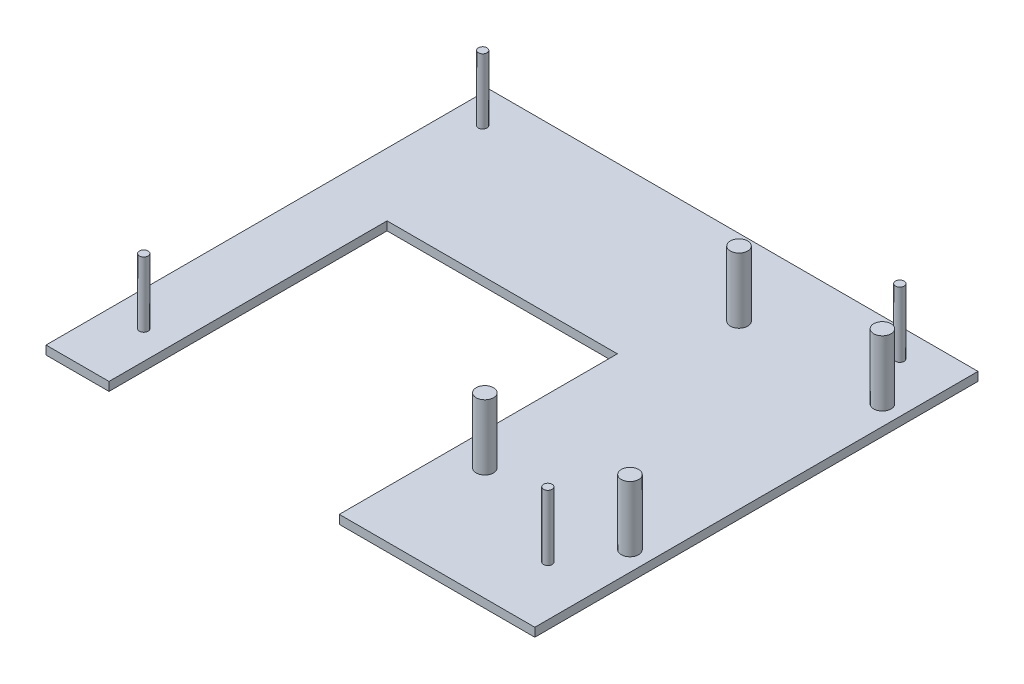
ISO-10303-21;
HEADER;
FILE_DESCRIPTION(('STEP AP214'),'2;1');
FILE_NAME('part.step','',(''),(''),'','','');
FILE_SCHEMA(('AUTOMOTIVE_DESIGN { 1 0 10303 214 1 1 1 1 }'));
ENDSEC;
DATA;
#1=APPLICATION_CONTEXT('core data for automotive mechanical design processes');
#2=APPLICATION_PROTOCOL_DEFINITION('international standard','automotive_design',2000,#1);
#3=PRODUCT_CONTEXT('',#1,'mechanical');
#4=PRODUCT('Part','Part','',(#3));
#5=PRODUCT_RELATED_PRODUCT_CATEGORY('part','',(#4));
#6=PRODUCT_DEFINITION_FORMATION('','',#4);
#7=PRODUCT_DEFINITION_CONTEXT('part definition',#1,'design');
#8=PRODUCT_DEFINITION('design','',#6,#7);
#9=PRODUCT_DEFINITION_SHAPE('','',#8);
#10=(LENGTH_UNIT() NAMED_UNIT(*) SI_UNIT(.MILLI.,.METRE.));
#11=(NAMED_UNIT(*) PLANE_ANGLE_UNIT() SI_UNIT($,.RADIAN.));
#12=(NAMED_UNIT(*) SI_UNIT($,.STERADIAN.) SOLID_ANGLE_UNIT());
#13=UNCERTAINTY_MEASURE_WITH_UNIT(LENGTH_MEASURE(1.E-05),#10,'distance_accuracy_value','');
#14=(GEOMETRIC_REPRESENTATION_CONTEXT(3) GLOBAL_UNCERTAINTY_ASSIGNED_CONTEXT((#13)) GLOBAL_UNIT_ASSIGNED_CONTEXT((#10,
#11,#12)) REPRESENTATION_CONTEXT('',''));
#15=CARTESIAN_POINT('',(0.,0.,0.));
#16=DIRECTION('',(0.,0.,1.));
#17=DIRECTION('',(1.,0.,0.));
#18=AXIS2_PLACEMENT_3D('',#15,#16,#17);
#19=CARTESIAN_POINT('',(-60.,2.,60.));
#20=DIRECTION('',(0.,0.,-1.));
#21=DIRECTION('',(-1.,0.,0.));
#22=AXIS2_PLACEMENT_3D('',#19,#20,#21);
#23=PLANE('',#22);
#24=DIRECTION('',(1.,0.,0.));
#25=VECTOR('',#24,1.);
#26=CARTESIAN_POINT('',(-60.,0.,60.));
#27=LINE('',#26,#25);
#28=CARTESIAN_POINT('',(-52.5000000000147,0.,60.0000000000187));
#29=VERTEX_POINT('',#28);
#30=CARTESIAN_POINT('',(-37.9999999999998,0.,60.0000000000187));
#31=VERTEX_POINT('',#30);
#32=EDGE_CURVE('E119',#29,#31,#27,.T.);
#33=ORIENTED_EDGE('',*,*,#32,.T.);
#34=DIRECTION('',(0.,1.,0.));
#35=VECTOR('',#34,1.);
#36=CARTESIAN_POINT('',(-37.9999999999998,-13.,60.0000000000187));
#37=LINE('',#36,#35);
#38=CARTESIAN_POINT('',(-37.9999999999998,2.,60.0000000000187));
#39=VERTEX_POINT('',#38);
#40=EDGE_CURVE('E104',#31,#39,#37,.T.);
#41=ORIENTED_EDGE('',*,*,#40,.T.);
#42=DIRECTION('',(1.,0.,0.));
#43=VECTOR('',#42,1.);
#44=CARTESIAN_POINT('',(-60.,2.,60.));
#45=LINE('',#44,#43);
#46=CARTESIAN_POINT('',(-52.5000000000147,2.,60.0000000000187));
#47=VERTEX_POINT('',#46);
#48=EDGE_CURVE('E117',#47,#39,#45,.T.);
#49=ORIENTED_EDGE('',*,*,#48,.F.);
#50=DIRECTION('',(0.,1.,0.));
#51=VECTOR('',#50,1.);
#52=CARTESIAN_POINT('',(-52.5000000000147,-13.,60.0000000000187));
#53=LINE('',#52,#51);
#54=EDGE_CURVE('E166',#29,#47,#53,.T.);
#55=ORIENTED_EDGE('',*,*,#54,.F.);
#56=EDGE_LOOP('',(#33,#41,#49,#55));
#57=FACE_BOUND('',#56,.T.);
#58=ADVANCED_FACE('F37',(#57),#23,.F.);
#59=CARTESIAN_POINT('',(60.,2.,-60.));
#60=DIRECTION('',(-1.,0.,0.));
#61=DIRECTION('',(0.,0.,1.));
#62=AXIS2_PLACEMENT_3D('',#59,#60,#61);
#63=PLANE('',#62);
#64=DIRECTION('',(0.,0.,-1.));
#65=VECTOR('',#64,1.);
#66=CARTESIAN_POINT('',(60.,0.,-60.));
#67=LINE('',#66,#65);
#68=CARTESIAN_POINT('',(60.,0.,60.));
#69=VERTEX_POINT('',#68);
#70=CARTESIAN_POINT('',(60.000000000006,0.,-41.9999999999999));
#71=VERTEX_POINT('',#70);
#72=EDGE_CURVE('E138',#69,#71,#67,.T.);
#73=ORIENTED_EDGE('',*,*,#72,.T.);
#74=DIRECTION('',(0.,1.,0.));
#75=VECTOR('',#74,1.);
#76=CARTESIAN_POINT('',(60.000000000006,-13.,-41.9999999999999));
#77=LINE('',#76,#75);
#78=CARTESIAN_POINT('',(60.000000000006,2.,-41.9999999999999));
#79=VERTEX_POINT('',#78);
#80=EDGE_CURVE('E167',#71,#79,#77,.T.);
#81=ORIENTED_EDGE('',*,*,#80,.T.);
#82=DIRECTION('',(0.,0.,-1.));
#83=VECTOR('',#82,1.);
#84=CARTESIAN_POINT('',(60.,2.,-60.));
#85=LINE('',#84,#83);
#86=CARTESIAN_POINT('',(60.,2.,60.));
#87=VERTEX_POINT('',#86);
#88=EDGE_CURVE('E134',#87,#79,#85,.T.);
#89=ORIENTED_EDGE('',*,*,#88,.F.);
#90=DIRECTION('',(0.,-1.,0.));
#91=VECTOR('',#90,1.);
#92=CARTESIAN_POINT('',(60.,2.,60.));
#93=LINE('',#92,#91);
#94=EDGE_CURVE('E128',#87,#69,#93,.T.);
#95=ORIENTED_EDGE('',*,*,#94,.T.);
#96=EDGE_LOOP('',(#73,#81,#89,#95));
#97=FACE_BOUND('',#96,.T.);
#98=ADVANCED_FACE('F39',(#97),#63,.F.);
#99=CARTESIAN_POINT('',(15.0000000000002,2.,60.0000000000187));
#100=VERTEX_POINT('',#99);
#101=EDGE_CURVE('E129',#100,#87,#45,.T.);
#102=ORIENTED_EDGE('',*,*,#101,.F.);
#103=DIRECTION('',(0.,1.,0.));
#104=VECTOR('',#103,1.);
#105=CARTESIAN_POINT('',(15.0000000000002,-13.,60.0000000000187));
#106=LINE('',#105,#104);
#107=CARTESIAN_POINT('',(15.0000000000002,0.,60.0000000000187));
#108=VERTEX_POINT('',#107);
#109=EDGE_CURVE('E120',#108,#100,#106,.T.);
#110=ORIENTED_EDGE('',*,*,#109,.F.);
#111=EDGE_CURVE('E141',#108,#69,#27,.T.);
#112=ORIENTED_EDGE('',*,*,#111,.T.);
#113=ORIENTED_EDGE('',*,*,#94,.F.);
#114=EDGE_LOOP('',(#102,#110,#112,#113));
#115=FACE_BOUND('',#114,.T.);
#116=ADVANCED_FACE('F222',(#115),#23,.F.);
#117=CARTESIAN_POINT('',(0.,2.,0.));
#118=DIRECTION('',(0.,1.,0.));
#119=DIRECTION('',(0.,0.,1.));
#120=AXIS2_PLACEMENT_3D('',#117,#118,#119);
#121=PLANE('',#120);
#122=DIRECTION('',(0.,0.,1.));
#123=VECTOR('',#122,1.);
#124=CARTESIAN_POINT('',(-37.9999999999999,2.,-4.00000000000009));
#125=LINE('',#124,#123);
#126=CARTESIAN_POINT('',(-37.9999999999999,2.,-4.00000000000009));
#127=VERTEX_POINT('',#126);
#128=EDGE_CURVE('E101',#127,#39,#125,.T.);
#129=ORIENTED_EDGE('',*,*,#128,.F.);
#130=DIRECTION('',(-1.,0.,0.));
#131=VECTOR('',#130,1.);
#132=CARTESIAN_POINT('',(-37.9999999999999,2.,-4.00000000000009));
#133=LINE('',#132,#131);
#134=CARTESIAN_POINT('',(15.0000000000002,2.,-4.00000000000009));
#135=VERTEX_POINT('',#134);
#136=EDGE_CURVE('E121',#135,#127,#133,.T.);
#137=ORIENTED_EDGE('',*,*,#136,.F.);
#138=DIRECTION('',(0.,0.,-1.));
#139=VECTOR('',#138,1.);
#140=CARTESIAN_POINT('',(15.0000000000002,2.,-4.00000000000009));
#141=LINE('',#140,#139);
#142=EDGE_CURVE('E111',#100,#135,#141,.T.);
#143=ORIENTED_EDGE('',*,*,#142,.F.);
#144=ORIENTED_EDGE('',*,*,#101,.T.);
#145=ORIENTED_EDGE('',*,*,#88,.T.);
#146=DIRECTION('',(1.00000000000035,0.,0.));
#147=VECTOR('',#146,1.);
#148=CARTESIAN_POINT('',(0.,2.,-41.9999999999999));
#149=LINE('',#148,#147);
#150=CARTESIAN_POINT('',(-52.5000000000092,2.,-41.9999999999999));
#151=VERTEX_POINT('',#150);
#152=EDGE_CURVE('E158',#151,#79,#149,.T.);
#153=ORIENTED_EDGE('',*,*,#152,.F.);
#154=DIRECTION('',(0.,0.,-1.00000000000028));
#155=VECTOR('',#154,1.);
#156=CARTESIAN_POINT('',(-52.5000000000172,2.,0.));
#157=LINE('',#156,#155);
#158=EDGE_CURVE('E127',#47,#151,#157,.T.);
#159=ORIENTED_EDGE('',*,*,#158,.F.);
#160=ORIENTED_EDGE('',*,*,#48,.T.);
#161=EDGE_LOOP('',(#129,#137,#143,#144,#145,#153,#159,#160));
#162=FACE_BOUND('',#161,.T.);
#163=CARTESIAN_POINT('',(-44.4999999999998,2.,45.4999999999999));
#164=DIRECTION('',(0.,1.,0.));
#165=DIRECTION('',(0.,0.,1.));
#166=AXIS2_PLACEMENT_3D('',#163,#164,#165);
#167=CIRCLE('',#166,0.999999999999998);
#168=CARTESIAN_POINT('',(-44.4999999999998,2.,46.4999999999999));
#169=VERTEX_POINT('',#168);
#170=EDGE_CURVE('E173',#169,#169,#167,.T.);
#171=ORIENTED_EDGE('',*,*,#170,.F.);
#172=EDGE_LOOP('',(#171));
#173=FACE_BOUND('',#172,.T.);
#174=CARTESIAN_POINT('',(-45.9999999999997,2.,-34.0000000000001));
#175=DIRECTION('',(0.,1.,0.));
#176=DIRECTION('',(0.,0.,1.));
#177=AXIS2_PLACEMENT_3D('',#174,#175,#176);
#178=CIRCLE('',#177,0.999999999999998);
#179=CARTESIAN_POINT('',(-45.9999999999997,2.,-33.0000000000001));
#180=VERTEX_POINT('',#179);
#181=EDGE_CURVE('E179',#180,#180,#178,.T.);
#182=ORIENTED_EDGE('',*,*,#181,.F.);
#183=EDGE_LOOP('',(#182));
#184=FACE_BOUND('',#183,.T.);
#185=CARTESIAN_POINT('',(48.5000000000003,2.,-35.4999999999999));
#186=DIRECTION('',(0.,1.,0.));
#187=DIRECTION('',(0.,0.,1.));
#188=AXIS2_PLACEMENT_3D('',#185,#186,#187);
#189=CIRCLE('',#188,0.999999999999998);
#190=CARTESIAN_POINT('',(48.5000000000003,2.,-34.4999999999999));
#191=VERTEX_POINT('',#190);
#192=EDGE_CURVE('E185',#191,#191,#189,.T.);
#193=ORIENTED_EDGE('',*,*,#192,.F.);
#194=EDGE_LOOP('',(#193));
#195=FACE_BOUND('',#194,.T.);
#196=CARTESIAN_POINT('',(22.5000000000003,2.,-24.5));
#197=DIRECTION('',(0.,1.,0.));
#198=DIRECTION('',(0.,0.,1.));
#199=AXIS2_PLACEMENT_3D('',#196,#197,#198);
#200=CIRCLE('',#199,2.);
#201=CARTESIAN_POINT('',(22.5000000000003,2.,-22.5));
#202=VERTEX_POINT('',#201);
#203=EDGE_CURVE('E191',#202,#202,#200,.T.);
#204=ORIENTED_EDGE('',*,*,#203,.F.);
#205=EDGE_LOOP('',(#204));
#206=FACE_BOUND('',#205,.T.);
#207=CARTESIAN_POINT('',(22.5000000000002,2.,34.0000000000001));
#208=DIRECTION('',(0.,1.,0.));
#209=DIRECTION('',(0.,0.,1.));
#210=AXIS2_PLACEMENT_3D('',#207,#208,#209);
#211=CIRCLE('',#210,2.);
#212=CARTESIAN_POINT('',(22.5000000000002,2.,36.0000000000001));
#213=VERTEX_POINT('',#212);
#214=EDGE_CURVE('E197',#213,#213,#211,.T.);
#215=ORIENTED_EDGE('',*,*,#214,.F.);
#216=EDGE_LOOP('',(#215));
#217=FACE_BOUND('',#216,.T.);
#218=CARTESIAN_POINT('',(48.5000000000002,2.,45.5000000000001));
#219=DIRECTION('',(0.,1.,0.));
#220=DIRECTION('',(0.,0.,1.));
#221=AXIS2_PLACEMENT_3D('',#218,#219,#220);
#222=CIRCLE('',#221,0.999999999999998);
#223=CARTESIAN_POINT('',(48.5000000000002,2.,46.5000000000001));
#224=VERTEX_POINT('',#223);
#225=EDGE_CURVE('E203',#224,#224,#222,.T.);
#226=ORIENTED_EDGE('',*,*,#225,.F.);
#227=EDGE_LOOP('',(#226));
#228=FACE_BOUND('',#227,.T.);
#229=CARTESIAN_POINT('',(55.5000000000002,2.,33.6000000000001));
#230=DIRECTION('',(0.,1.,0.));
#231=DIRECTION('',(0.,0.,1.));
#232=AXIS2_PLACEMENT_3D('',#229,#230,#231);
#233=CIRCLE('',#232,2.);
#234=CARTESIAN_POINT('',(55.5000000000002,2.,35.6000000000001));
#235=VERTEX_POINT('',#234);
#236=EDGE_CURVE('E209',#235,#235,#233,.T.);
#237=ORIENTED_EDGE('',*,*,#236,.F.);
#238=EDGE_LOOP('',(#237));
#239=FACE_BOUND('',#238,.T.);
#240=CARTESIAN_POINT('',(55.5000000000003,2.,-24.4999999999999));
#241=DIRECTION('',(0.,1.,0.));
#242=DIRECTION('',(0.,0.,1.));
#243=AXIS2_PLACEMENT_3D('',#240,#241,#242);
#244=CIRCLE('',#243,2.);
#245=CARTESIAN_POINT('',(55.5000000000003,2.,-22.4999999999999));
#246=VERTEX_POINT('',#245);
#247=EDGE_CURVE('E212',#246,#246,#244,.T.);
#248=ORIENTED_EDGE('',*,*,#247,.F.);
#249=EDGE_LOOP('',(#248));
#250=FACE_BOUND('',#249,.T.);
#251=ADVANCED_FACE('F124',(#162,#173,#184,#195,#206,#217,#228,#239,#250),#121,.T.);
#252=CARTESIAN_POINT('',(0.,0.,0.));
#253=DIRECTION('',(0.,1.,0.));
#254=DIRECTION('',(0.,0.,1.));
#255=AXIS2_PLACEMENT_3D('',#252,#253,#254);
#256=PLANE('',#255);
#257=DIRECTION('',(-1.,0.,0.));
#258=VECTOR('',#257,1.);
#259=CARTESIAN_POINT('',(0.,0.,-4.00000000000009));
#260=LINE('',#259,#258);
#261=CARTESIAN_POINT('',(15.0000000000002,0.,-4.00000000000009));
#262=VERTEX_POINT('',#261);
#263=CARTESIAN_POINT('',(-37.9999999999999,0.,-4.00000000000009));
#264=VERTEX_POINT('',#263);
#265=EDGE_CURVE('E45',#262,#264,#260,.T.);
#266=ORIENTED_EDGE('',*,*,#265,.T.);
#267=DIRECTION('',(0.,0.,1.));
#268=VECTOR('',#267,1.);
#269=CARTESIAN_POINT('',(-37.9999999999999,0.,0.));
#270=LINE('',#269,#268);
#271=EDGE_CURVE('E11',#264,#31,#270,.T.);
#272=ORIENTED_EDGE('',*,*,#271,.T.);
#273=ORIENTED_EDGE('',*,*,#32,.F.);
#274=DIRECTION('',(0.,0.,-1.));
#275=VECTOR('',#274,1.);
#276=CARTESIAN_POINT('',(-52.5000000000172,0.,0.));
#277=LINE('',#276,#275);
#278=CARTESIAN_POINT('',(-52.5000000000172,0.,-41.9999999999999));
#279=VERTEX_POINT('',#278);
#280=EDGE_CURVE('E132',#29,#279,#277,.T.);
#281=ORIENTED_EDGE('',*,*,#280,.T.);
#282=DIRECTION('',(1.,0.,0.));
#283=VECTOR('',#282,1.);
#284=CARTESIAN_POINT('',(0.,0.,-41.9999999999999));
#285=LINE('',#284,#283);
#286=EDGE_CURVE('E146',#279,#71,#285,.T.);
#287=ORIENTED_EDGE('',*,*,#286,.T.);
#288=ORIENTED_EDGE('',*,*,#72,.F.);
#289=ORIENTED_EDGE('',*,*,#111,.F.);
#290=DIRECTION('',(0.,0.,-1.));
#291=VECTOR('',#290,1.);
#292=CARTESIAN_POINT('',(15.0000000000002,0.,0.));
#293=LINE('',#292,#291);
#294=EDGE_CURVE('E149',#108,#262,#293,.T.);
#295=ORIENTED_EDGE('',*,*,#294,.T.);
#296=EDGE_LOOP('',(#266,#272,#273,#281,#287,#288,#289,#295));
#297=FACE_BOUND('',#296,.T.);
#298=ADVANCED_FACE('F153',(#297),#256,.F.);
#299=CARTESIAN_POINT('',(55.5000000000003,17.,-24.4999999999999));
#300=DIRECTION('',(0.,-1.,0.));
#301=DIRECTION('',(0.,0.,-1.));
#302=AXIS2_PLACEMENT_3D('',#299,#300,#301);
#303=CYLINDRICAL_SURFACE('',#302,2.);
#304=CARTESIAN_POINT('',(55.5000000000003,17.,-24.4999999999999));
#305=DIRECTION('',(0.,1.,0.));
#306=DIRECTION('',(0.,0.,1.));
#307=AXIS2_PLACEMENT_3D('',#304,#305,#306);
#308=CIRCLE('',#307,2.);
#309=CARTESIAN_POINT('',(55.5000000000003,17.,-22.4999999999999));
#310=VERTEX_POINT('',#309);
#311=EDGE_CURVE('E142',#310,#310,#308,.T.);
#312=ORIENTED_EDGE('',*,*,#311,.F.);
#313=EDGE_LOOP('',(#312));
#314=FACE_BOUND('',#313,.T.);
#315=ORIENTED_EDGE('',*,*,#247,.T.);
#316=EDGE_LOOP('',(#315));
#317=FACE_BOUND('',#316,.T.);
#318=ADVANCED_FACE('F219',(#314,#317),#303,.T.);
#319=CARTESIAN_POINT('',(55.5000000000003,17.,-24.4999999999999));
#320=DIRECTION('',(0.,1.,0.));
#321=DIRECTION('',(0.,0.,1.));
#322=AXIS2_PLACEMENT_3D('',#319,#320,#321);
#323=PLANE('',#322);
#324=ORIENTED_EDGE('',*,*,#311,.T.);
#325=EDGE_LOOP('',(#324));
#326=FACE_BOUND('',#325,.T.);
#327=ADVANCED_FACE('F314',(#326),#323,.T.);
#328=CARTESIAN_POINT('',(55.5000000000002,17.,33.6000000000001));
#329=DIRECTION('',(0.,-1.,0.));
#330=DIRECTION('',(0.,0.,-1.));
#331=AXIS2_PLACEMENT_3D('',#328,#329,#330);
#332=CYLINDRICAL_SURFACE('',#331,2.);
#333=CARTESIAN_POINT('',(55.5000000000002,17.,33.6000000000001));
#334=DIRECTION('',(0.,1.,0.));
#335=DIRECTION('',(0.,0.,1.));
#336=AXIS2_PLACEMENT_3D('',#333,#334,#335);
#337=CIRCLE('',#336,2.);
#338=CARTESIAN_POINT('',(55.5000000000002,17.,35.6000000000001));
#339=VERTEX_POINT('',#338);
#340=EDGE_CURVE('E206',#339,#339,#337,.T.);
#341=ORIENTED_EDGE('',*,*,#340,.F.);
#342=EDGE_LOOP('',(#341));
#343=FACE_BOUND('',#342,.T.);
#344=ORIENTED_EDGE('',*,*,#236,.T.);
#345=EDGE_LOOP('',(#344));
#346=FACE_BOUND('',#345,.T.);
#347=ADVANCED_FACE('F311',(#343,#346),#332,.T.);
#348=CARTESIAN_POINT('',(55.5000000000002,17.,33.6000000000001));
#349=DIRECTION('',(0.,1.,0.));
#350=DIRECTION('',(0.,0.,1.));
#351=AXIS2_PLACEMENT_3D('',#348,#349,#350);
#352=PLANE('',#351);
#353=ORIENTED_EDGE('',*,*,#340,.T.);
#354=EDGE_LOOP('',(#353));
#355=FACE_BOUND('',#354,.T.);
#356=ADVANCED_FACE('F306',(#355),#352,.T.);
#357=CARTESIAN_POINT('',(48.5000000000002,17.,45.5000000000001));
#358=DIRECTION('',(0.,-1.,0.));
#359=DIRECTION('',(0.,0.,-1.));
#360=AXIS2_PLACEMENT_3D('',#357,#358,#359);
#361=CYLINDRICAL_SURFACE('',#360,0.999999999999998);
#362=CARTESIAN_POINT('',(48.5000000000002,17.,45.5000000000001));
#363=DIRECTION('',(0.,1.,0.));
#364=DIRECTION('',(0.,0.,1.));
#365=AXIS2_PLACEMENT_3D('',#362,#363,#364);
#366=CIRCLE('',#365,0.999999999999998);
#367=CARTESIAN_POINT('',(48.5000000000002,17.,46.5000000000001));
#368=VERTEX_POINT('',#367);
#369=EDGE_CURVE('E200',#368,#368,#366,.T.);
#370=ORIENTED_EDGE('',*,*,#369,.F.);
#371=EDGE_LOOP('',(#370));
#372=FACE_BOUND('',#371,.T.);
#373=ORIENTED_EDGE('',*,*,#225,.T.);
#374=EDGE_LOOP('',(#373));
#375=FACE_BOUND('',#374,.T.);
#376=ADVANCED_FACE('F303',(#372,#375),#361,.T.);
#377=CARTESIAN_POINT('',(48.5000000000002,17.,45.5000000000001));
#378=DIRECTION('',(0.,1.,0.));
#379=DIRECTION('',(0.,0.,1.));
#380=AXIS2_PLACEMENT_3D('',#377,#378,#379);
#381=PLANE('',#380);
#382=ORIENTED_EDGE('',*,*,#369,.T.);
#383=EDGE_LOOP('',(#382));
#384=FACE_BOUND('',#383,.T.);
#385=ADVANCED_FACE('F298',(#384),#381,.T.);
#386=CARTESIAN_POINT('',(22.5000000000002,17.,34.0000000000001));
#387=DIRECTION('',(0.,-1.,0.));
#388=DIRECTION('',(0.,0.,-1.));
#389=AXIS2_PLACEMENT_3D('',#386,#387,#388);
#390=CYLINDRICAL_SURFACE('',#389,2.);
#391=CARTESIAN_POINT('',(22.5000000000002,17.,34.0000000000001));
#392=DIRECTION('',(0.,1.,0.));
#393=DIRECTION('',(0.,0.,1.));
#394=AXIS2_PLACEMENT_3D('',#391,#392,#393);
#395=CIRCLE('',#394,2.);
#396=CARTESIAN_POINT('',(22.5000000000002,17.,36.0000000000001));
#397=VERTEX_POINT('',#396);
#398=EDGE_CURVE('E194',#397,#397,#395,.T.);
#399=ORIENTED_EDGE('',*,*,#398,.F.);
#400=EDGE_LOOP('',(#399));
#401=FACE_BOUND('',#400,.T.);
#402=ORIENTED_EDGE('',*,*,#214,.T.);
#403=EDGE_LOOP('',(#402));
#404=FACE_BOUND('',#403,.T.);
#405=ADVANCED_FACE('F295',(#401,#404),#390,.T.);
#406=CARTESIAN_POINT('',(22.5000000000002,17.,34.0000000000001));
#407=DIRECTION('',(0.,1.,0.));
#408=DIRECTION('',(0.,0.,1.));
#409=AXIS2_PLACEMENT_3D('',#406,#407,#408);
#410=PLANE('',#409);
#411=ORIENTED_EDGE('',*,*,#398,.T.);
#412=EDGE_LOOP('',(#411));
#413=FACE_BOUND('',#412,.T.);
#414=ADVANCED_FACE('F290',(#413),#410,.T.);
#415=CARTESIAN_POINT('',(22.5000000000003,17.,-24.5));
#416=DIRECTION('',(0.,-1.,0.));
#417=DIRECTION('',(0.,0.,-1.));
#418=AXIS2_PLACEMENT_3D('',#415,#416,#417);
#419=CYLINDRICAL_SURFACE('',#418,2.);
#420=CARTESIAN_POINT('',(22.5000000000003,17.,-24.5));
#421=DIRECTION('',(0.,1.,0.));
#422=DIRECTION('',(0.,0.,1.));
#423=AXIS2_PLACEMENT_3D('',#420,#421,#422);
#424=CIRCLE('',#423,2.);
#425=CARTESIAN_POINT('',(22.5000000000003,17.,-22.5));
#426=VERTEX_POINT('',#425);
#427=EDGE_CURVE('E188',#426,#426,#424,.T.);
#428=ORIENTED_EDGE('',*,*,#427,.F.);
#429=EDGE_LOOP('',(#428));
#430=FACE_BOUND('',#429,.T.);
#431=ORIENTED_EDGE('',*,*,#203,.T.);
#432=EDGE_LOOP('',(#431));
#433=FACE_BOUND('',#432,.T.);
#434=ADVANCED_FACE('F287',(#430,#433),#419,.T.);
#435=CARTESIAN_POINT('',(22.5000000000003,17.,-24.5));
#436=DIRECTION('',(0.,1.,0.));
#437=DIRECTION('',(0.,0.,1.));
#438=AXIS2_PLACEMENT_3D('',#435,#436,#437);
#439=PLANE('',#438);
#440=ORIENTED_EDGE('',*,*,#427,.T.);
#441=EDGE_LOOP('',(#440));
#442=FACE_BOUND('',#441,.T.);
#443=ADVANCED_FACE('F282',(#442),#439,.T.);
#444=CARTESIAN_POINT('',(48.5000000000003,17.,-35.4999999999999));
#445=DIRECTION('',(0.,-1.,0.));
#446=DIRECTION('',(0.,0.,-1.));
#447=AXIS2_PLACEMENT_3D('',#444,#445,#446);
#448=CYLINDRICAL_SURFACE('',#447,0.999999999999998);
#449=CARTESIAN_POINT('',(48.5000000000003,17.,-35.4999999999999));
#450=DIRECTION('',(0.,1.,0.));
#451=DIRECTION('',(0.,0.,1.));
#452=AXIS2_PLACEMENT_3D('',#449,#450,#451);
#453=CIRCLE('',#452,0.999999999999998);
#454=CARTESIAN_POINT('',(48.5000000000003,17.,-34.4999999999999));
#455=VERTEX_POINT('',#454);
#456=EDGE_CURVE('E182',#455,#455,#453,.T.);
#457=ORIENTED_EDGE('',*,*,#456,.F.);
#458=EDGE_LOOP('',(#457));
#459=FACE_BOUND('',#458,.T.);
#460=ORIENTED_EDGE('',*,*,#192,.T.);
#461=EDGE_LOOP('',(#460));
#462=FACE_BOUND('',#461,.T.);
#463=ADVANCED_FACE('F279',(#459,#462),#448,.T.);
#464=CARTESIAN_POINT('',(48.5000000000003,17.,-35.4999999999999));
#465=DIRECTION('',(0.,1.,0.));
#466=DIRECTION('',(0.,0.,1.));
#467=AXIS2_PLACEMENT_3D('',#464,#465,#466);
#468=PLANE('',#467);
#469=ORIENTED_EDGE('',*,*,#456,.T.);
#470=EDGE_LOOP('',(#469));
#471=FACE_BOUND('',#470,.T.);
#472=ADVANCED_FACE('F274',(#471),#468,.T.);
#473=CARTESIAN_POINT('',(-45.9999999999997,17.,-34.0000000000001));
#474=DIRECTION('',(0.,-1.,0.));
#475=DIRECTION('',(0.,0.,-1.));
#476=AXIS2_PLACEMENT_3D('',#473,#474,#475);
#477=CYLINDRICAL_SURFACE('',#476,0.999999999999998);
#478=CARTESIAN_POINT('',(-45.9999999999997,17.,-34.0000000000001));
#479=DIRECTION('',(0.,1.,0.));
#480=DIRECTION('',(0.,0.,1.));
#481=AXIS2_PLACEMENT_3D('',#478,#479,#480);
#482=CIRCLE('',#481,0.999999999999998);
#483=CARTESIAN_POINT('',(-45.9999999999997,17.,-33.0000000000001));
#484=VERTEX_POINT('',#483);
#485=EDGE_CURVE('E176',#484,#484,#482,.T.);
#486=ORIENTED_EDGE('',*,*,#485,.F.);
#487=EDGE_LOOP('',(#486));
#488=FACE_BOUND('',#487,.T.);
#489=ORIENTED_EDGE('',*,*,#181,.T.);
#490=EDGE_LOOP('',(#489));
#491=FACE_BOUND('',#490,.T.);
#492=ADVANCED_FACE('F271',(#488,#491),#477,.T.);
#493=CARTESIAN_POINT('',(-45.9999999999997,17.,-34.0000000000001));
#494=DIRECTION('',(0.,1.,0.));
#495=DIRECTION('',(0.,0.,1.));
#496=AXIS2_PLACEMENT_3D('',#493,#494,#495);
#497=PLANE('',#496);
#498=ORIENTED_EDGE('',*,*,#485,.T.);
#499=EDGE_LOOP('',(#498));
#500=FACE_BOUND('',#499,.T.);
#501=ADVANCED_FACE('F266',(#500),#497,.T.);
#502=CARTESIAN_POINT('',(-44.4999999999998,17.,45.4999999999999));
#503=DIRECTION('',(0.,-1.,0.));
#504=DIRECTION('',(0.,0.,-1.));
#505=AXIS2_PLACEMENT_3D('',#502,#503,#504);
#506=CYLINDRICAL_SURFACE('',#505,0.999999999999998);
#507=CARTESIAN_POINT('',(-44.4999999999998,17.,45.4999999999999));
#508=DIRECTION('',(0.,1.,0.));
#509=DIRECTION('',(0.,0.,1.));
#510=AXIS2_PLACEMENT_3D('',#507,#508,#509);
#511=CIRCLE('',#510,0.999999999999998);
#512=CARTESIAN_POINT('',(-44.4999999999998,17.,46.4999999999999));
#513=VERTEX_POINT('',#512);
#514=EDGE_CURVE('E170',#513,#513,#511,.T.);
#515=ORIENTED_EDGE('',*,*,#514,.F.);
#516=EDGE_LOOP('',(#515));
#517=FACE_BOUND('',#516,.T.);
#518=ORIENTED_EDGE('',*,*,#170,.T.);
#519=EDGE_LOOP('',(#518));
#520=FACE_BOUND('',#519,.T.);
#521=ADVANCED_FACE('F263',(#517,#520),#506,.T.);
#522=CARTESIAN_POINT('',(-44.4999999999998,17.,45.4999999999999));
#523=DIRECTION('',(0.,1.,0.));
#524=DIRECTION('',(0.,0.,1.));
#525=AXIS2_PLACEMENT_3D('',#522,#523,#524);
#526=PLANE('',#525);
#527=ORIENTED_EDGE('',*,*,#514,.T.);
#528=EDGE_LOOP('',(#527));
#529=FACE_BOUND('',#528,.T.);
#530=ADVANCED_FACE('F260',(#529),#526,.T.);
#531=CARTESIAN_POINT('',(0.,-13.,-41.9999999999999));
#532=DIRECTION('',(0.,0.,1.));
#533=DIRECTION('',(1.,0.,0.));
#534=AXIS2_PLACEMENT_3D('',#531,#532,#533);
#535=PLANE('',#534);
#536=DIRECTION('',(0.,1.,0.));
#537=VECTOR('',#536,1.);
#538=CARTESIAN_POINT('',(-52.5000000000092,-13.,-41.9999999999999));
#539=LINE('',#538,#537);
#540=EDGE_CURVE('E60',#279,#151,#539,.T.);
#541=ORIENTED_EDGE('',*,*,#540,.T.);
#542=ORIENTED_EDGE('',*,*,#152,.T.);
#543=ORIENTED_EDGE('',*,*,#80,.F.);
#544=ORIENTED_EDGE('',*,*,#286,.F.);
#545=EDGE_LOOP('',(#541,#542,#543,#544));
#546=FACE_BOUND('',#545,.T.);
#547=ADVANCED_FACE('F243',(#546),#535,.F.);
#548=CARTESIAN_POINT('',(-52.5000000000172,-13.,0.));
#549=DIRECTION('',(1.,0.,0.));
#550=DIRECTION('',(0.,0.,-1.));
#551=AXIS2_PLACEMENT_3D('',#548,#549,#550);
#552=PLANE('',#551);
#553=ORIENTED_EDGE('',*,*,#54,.T.);
#554=ORIENTED_EDGE('',*,*,#158,.T.);
#555=ORIENTED_EDGE('',*,*,#540,.F.);
#556=ORIENTED_EDGE('',*,*,#280,.F.);
#557=EDGE_LOOP('',(#553,#554,#555,#556));
#558=FACE_BOUND('',#557,.T.);
#559=ADVANCED_FACE('F257',(#558),#552,.F.);
#560=CARTESIAN_POINT('',(-37.9999999999999,-13.,-4.00000000000009));
#561=DIRECTION('',(-1.,0.,0.));
#562=DIRECTION('',(0.,0.,1.));
#563=AXIS2_PLACEMENT_3D('',#560,#561,#562);
#564=PLANE('',#563);
#565=DIRECTION('',(0.,1.,0.));
#566=VECTOR('',#565,1.);
#567=CARTESIAN_POINT('',(-37.9999999999999,-13.,-4.00000000000009));
#568=LINE('',#567,#566);
#569=EDGE_CURVE('E106',#264,#127,#568,.T.);
#570=ORIENTED_EDGE('',*,*,#569,.T.);
#571=ORIENTED_EDGE('',*,*,#128,.T.);
#572=ORIENTED_EDGE('',*,*,#40,.F.);
#573=ORIENTED_EDGE('',*,*,#271,.F.);
#574=EDGE_LOOP('',(#570,#571,#572,#573));
#575=FACE_BOUND('',#574,.T.);
#576=ADVANCED_FACE('F103',(#575),#564,.F.);
#577=CARTESIAN_POINT('',(-37.9999999999999,-13.,-4.00000000000009));
#578=DIRECTION('',(0.,0.,-1.));
#579=DIRECTION('',(-1.,0.,0.));
#580=AXIS2_PLACEMENT_3D('',#577,#578,#579);
#581=PLANE('',#580);
#582=DIRECTION('',(0.,1.,0.));
#583=VECTOR('',#582,1.);
#584=CARTESIAN_POINT('',(15.0000000000002,-13.,-4.00000000000009));
#585=LINE('',#584,#583);
#586=EDGE_CURVE('E52',#262,#135,#585,.T.);
#587=ORIENTED_EDGE('',*,*,#586,.T.);
#588=ORIENTED_EDGE('',*,*,#136,.T.);
#589=ORIENTED_EDGE('',*,*,#569,.F.);
#590=ORIENTED_EDGE('',*,*,#265,.F.);
#591=EDGE_LOOP('',(#587,#588,#589,#590));
#592=FACE_BOUND('',#591,.T.);
#593=ADVANCED_FACE('F156',(#592),#581,.F.);
#594=CARTESIAN_POINT('',(15.0000000000002,-13.,-4.00000000000009));
#595=DIRECTION('',(1.,0.,0.));
#596=DIRECTION('',(0.,0.,-1.));
#597=AXIS2_PLACEMENT_3D('',#594,#595,#596);
#598=PLANE('',#597);
#599=ORIENTED_EDGE('',*,*,#109,.T.);
#600=ORIENTED_EDGE('',*,*,#142,.T.);
#601=ORIENTED_EDGE('',*,*,#586,.F.);
#602=ORIENTED_EDGE('',*,*,#294,.F.);
#603=EDGE_LOOP('',(#599,#600,#601,#602));
#604=FACE_BOUND('',#603,.T.);
#605=ADVANCED_FACE('F247',(#604),#598,.F.);
#606=CLOSED_SHELL('',(#58,#98,#116,#251,#298,#318,#327,#347,#356,#376,#385,#405,#414,#434,#443,
#463,#472,#492,#501,#521,#530,#547,#559,#576,#593,#605));
#607=MANIFOLD_SOLID_BREP('B2',#606);
#608=ADVANCED_BREP_SHAPE_REPRESENTATION('',(#18,#607),#14);
#609=SHAPE_DEFINITION_REPRESENTATION(#9,#608);
ENDSEC;
END-ISO-10303-21;
